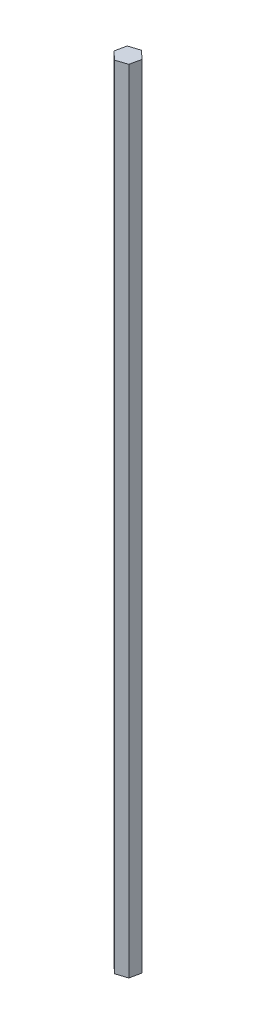
ISO-10303-21;
HEADER;
FILE_DESCRIPTION(('STEP AP214'),'2;1');
FILE_NAME('part.step','',(''),(''),'','','');
FILE_SCHEMA(('AUTOMOTIVE_DESIGN { 1 0 10303 214 1 1 1 1 }'));
ENDSEC;
DATA;
#1=APPLICATION_CONTEXT('core data for automotive mechanical design processes');
#2=APPLICATION_PROTOCOL_DEFINITION('international standard','automotive_design',2000,#1);
#3=PRODUCT_CONTEXT('',#1,'mechanical');
#4=PRODUCT('Part','Part','',(#3));
#5=PRODUCT_RELATED_PRODUCT_CATEGORY('part','',(#4));
#6=PRODUCT_DEFINITION_FORMATION('','',#4);
#7=PRODUCT_DEFINITION_CONTEXT('part definition',#1,'design');
#8=PRODUCT_DEFINITION('design','',#6,#7);
#9=PRODUCT_DEFINITION_SHAPE('','',#8);
#10=(LENGTH_UNIT() NAMED_UNIT(*) SI_UNIT(.MILLI.,.METRE.));
#11=(NAMED_UNIT(*) PLANE_ANGLE_UNIT() SI_UNIT($,.RADIAN.));
#12=(NAMED_UNIT(*) SI_UNIT($,.STERADIAN.) SOLID_ANGLE_UNIT());
#13=UNCERTAINTY_MEASURE_WITH_UNIT(LENGTH_MEASURE(1.E-05),#10,'distance_accuracy_value','');
#14=(GEOMETRIC_REPRESENTATION_CONTEXT(3) GLOBAL_UNCERTAINTY_ASSIGNED_CONTEXT((#13)) GLOBAL_UNIT_ASSIGNED_CONTEXT((#10,
#11,#12)) REPRESENTATION_CONTEXT('',''));
#15=CARTESIAN_POINT('',(0.,0.,0.));
#16=DIRECTION('',(0.,0.,1.));
#17=DIRECTION('',(1.,0.,0.));
#18=AXIS2_PLACEMENT_3D('',#15,#16,#17);
#19=CARTESIAN_POINT('',(-0.61182187926995,203.2,2.82117126764399));
#20=DIRECTION('',(-0.305094633460301,0.,-0.952322038300976));
#21=DIRECTION('',(-0.952322038300976,0.,0.305094633460301));
#22=AXIS2_PLACEMENT_3D('',#19,#20,#21);
#23=PLANE('',#22);
#24=DIRECTION('',(0.952322038300976,0.,-0.305094633460301));
#25=VECTOR('',#24,1.);
#26=CARTESIAN_POINT('',(-0.61182187926995,0.,2.82117126764399));
#27=LINE('',#26,#25);
#28=CARTESIAN_POINT('',(-0.61182187926995,0.,2.82117126764399));
#29=VERTEX_POINT('',#28);
#30=CARTESIAN_POINT('',(2.13729504657146,0.,1.94043892386091));
#31=VERTEX_POINT('',#30);
#32=EDGE_CURVE('E117',#29,#31,#27,.T.);
#33=ORIENTED_EDGE('',*,*,#32,.T.);
#34=DIRECTION('',(0.,-1.,0.));
#35=VECTOR('',#34,1.);
#36=CARTESIAN_POINT('',(2.13729504657146,203.2,1.94043892386091));
#37=LINE('',#36,#35);
#38=CARTESIAN_POINT('',(2.13729504657146,203.2,1.94043892386091));
#39=VERTEX_POINT('',#38);
#40=EDGE_CURVE('E11',#39,#31,#37,.T.);
#41=ORIENTED_EDGE('',*,*,#40,.F.);
#42=DIRECTION('',(0.952322038300976,0.,-0.305094633460301));
#43=VECTOR('',#42,1.);
#44=CARTESIAN_POINT('',(-0.61182187926995,203.2,2.82117126764399));
#45=LINE('',#44,#43);
#46=CARTESIAN_POINT('',(-0.61182187926995,203.2,2.82117126764399));
#47=VERTEX_POINT('',#46);
#48=EDGE_CURVE('E127',#47,#39,#45,.T.);
#49=ORIENTED_EDGE('',*,*,#48,.F.);
#50=DIRECTION('',(0.,-1.,0.));
#51=VECTOR('',#50,1.);
#52=CARTESIAN_POINT('',(-0.61182187926995,203.2,2.82117126764399));
#53=LINE('',#52,#51);
#54=EDGE_CURVE('E113',#47,#29,#53,.T.);
#55=ORIENTED_EDGE('',*,*,#54,.T.);
#56=EDGE_LOOP('',(#33,#41,#49,#55));
#57=FACE_BOUND('',#56,.T.);
#58=ADVANCED_FACE('F33',(#57),#23,.F.);
#59=CARTESIAN_POINT('',(2.13729504657146,203.2,1.94043892386091));
#60=DIRECTION('',(-0.977282394482572,0.,-0.211941316015566));
#61=DIRECTION('',(-0.211941316015566,0.,0.977282394482572));
#62=AXIS2_PLACEMENT_3D('',#59,#60,#61);
#63=PLANE('',#62);
#64=DIRECTION('',(0.211941316015566,0.,-0.977282394482572));
#65=VECTOR('',#64,1.);
#66=CARTESIAN_POINT('',(2.13729504657146,0.,1.94043892386091));
#67=LINE('',#66,#65);
#68=CARTESIAN_POINT('',(2.74911692584142,0.,-0.880732343783076));
#69=VERTEX_POINT('',#68);
#70=EDGE_CURVE('E120',#31,#69,#67,.T.);
#71=ORIENTED_EDGE('',*,*,#70,.T.);
#72=DIRECTION('',(0.,-1.,0.));
#73=VECTOR('',#72,1.);
#74=CARTESIAN_POINT('',(2.74911692584142,203.2,-0.880732343783076));
#75=LINE('',#74,#73);
#76=CARTESIAN_POINT('',(2.74911692584142,203.2,-0.880732343783076));
#77=VERTEX_POINT('',#76);
#78=EDGE_CURVE('E41',#77,#69,#75,.T.);
#79=ORIENTED_EDGE('',*,*,#78,.F.);
#80=DIRECTION('',(0.211941316015566,0.,-0.977282394482572));
#81=VECTOR('',#80,1.);
#82=CARTESIAN_POINT('',(2.13729504657146,203.2,1.94043892386091));
#83=LINE('',#82,#81);
#84=EDGE_CURVE('E86',#39,#77,#83,.T.);
#85=ORIENTED_EDGE('',*,*,#84,.F.);
#86=ORIENTED_EDGE('',*,*,#40,.T.);
#87=EDGE_LOOP('',(#71,#79,#85,#86));
#88=FACE_BOUND('',#87,.T.);
#89=ADVANCED_FACE('F151',(#88),#63,.F.);
#90=CARTESIAN_POINT('',(2.74911692584142,203.2,-0.880732343783076));
#91=DIRECTION('',(-0.672187761022271,0.,0.74038072228541));
#92=DIRECTION('',(0.74038072228541,0.,0.672187761022271));
#93=AXIS2_PLACEMENT_3D('',#90,#91,#92);
#94=PLANE('',#93);
#95=DIRECTION('',(-0.74038072228541,0.,-0.672187761022271));
#96=VECTOR('',#95,1.);
#97=CARTESIAN_POINT('',(2.74911692584142,0.,-0.880732343783076));
#98=LINE('',#97,#96);
#99=CARTESIAN_POINT('',(0.611821879269952,0.,-2.82117126764399));
#100=VERTEX_POINT('',#99);
#101=EDGE_CURVE('E122',#69,#100,#98,.T.);
#102=ORIENTED_EDGE('',*,*,#101,.T.);
#103=DIRECTION('',(0.,-1.,0.));
#104=VECTOR('',#103,1.);
#105=CARTESIAN_POINT('',(0.611821879269952,203.2,-2.82117126764399));
#106=LINE('',#105,#104);
#107=CARTESIAN_POINT('',(0.611821879269952,203.2,-2.82117126764399));
#108=VERTEX_POINT('',#107);
#109=EDGE_CURVE('E108',#108,#100,#106,.T.);
#110=ORIENTED_EDGE('',*,*,#109,.F.);
#111=DIRECTION('',(-0.74038072228541,0.,-0.672187761022271));
#112=VECTOR('',#111,1.);
#113=CARTESIAN_POINT('',(2.74911692584142,203.2,-0.880732343783076));
#114=LINE('',#113,#112);
#115=EDGE_CURVE('E99',#77,#108,#114,.T.);
#116=ORIENTED_EDGE('',*,*,#115,.F.);
#117=ORIENTED_EDGE('',*,*,#78,.T.);
#118=EDGE_LOOP('',(#102,#110,#116,#117));
#119=FACE_BOUND('',#118,.T.);
#120=ADVANCED_FACE('F133',(#119),#94,.F.);
#121=CARTESIAN_POINT('',(0.611821879269952,203.2,-2.82117126764399));
#122=DIRECTION('',(0.305094633460301,0.,0.952322038300976));
#123=DIRECTION('',(0.952322038300976,0.,-0.305094633460301));
#124=AXIS2_PLACEMENT_3D('',#121,#122,#123);
#125=PLANE('',#124);
#126=DIRECTION('',(-0.952322038300976,0.,0.305094633460301));
#127=VECTOR('',#126,1.);
#128=CARTESIAN_POINT('',(0.611821879269952,0.,-2.82117126764399));
#129=LINE('',#128,#127);
#130=CARTESIAN_POINT('',(-2.13729504657146,0.,-1.94043892386091));
#131=VERTEX_POINT('',#130);
#132=EDGE_CURVE('E107',#100,#131,#129,.T.);
#133=ORIENTED_EDGE('',*,*,#132,.T.);
#134=DIRECTION('',(0.,-1.,0.));
#135=VECTOR('',#134,1.);
#136=CARTESIAN_POINT('',(-2.13729504657146,203.2,-1.94043892386091));
#137=LINE('',#136,#135);
#138=CARTESIAN_POINT('',(-2.13729504657146,203.2,-1.94043892386091));
#139=VERTEX_POINT('',#138);
#140=EDGE_CURVE('E104',#139,#131,#137,.T.);
#141=ORIENTED_EDGE('',*,*,#140,.F.);
#142=DIRECTION('',(-0.952322038300976,0.,0.305094633460301));
#143=VECTOR('',#142,1.);
#144=CARTESIAN_POINT('',(0.611821879269952,203.2,-2.82117126764399));
#145=LINE('',#144,#143);
#146=EDGE_CURVE('E93',#108,#139,#145,.T.);
#147=ORIENTED_EDGE('',*,*,#146,.F.);
#148=ORIENTED_EDGE('',*,*,#109,.T.);
#149=EDGE_LOOP('',(#133,#141,#147,#148));
#150=FACE_BOUND('',#149,.T.);
#151=ADVANCED_FACE('F105',(#150),#125,.F.);
#152=CARTESIAN_POINT('',(-2.13729504657146,203.2,-1.94043892386091));
#153=DIRECTION('',(0.977282394482572,0.,0.211941316015565));
#154=DIRECTION('',(0.211941316015565,0.,-0.977282394482572));
#155=AXIS2_PLACEMENT_3D('',#152,#153,#154);
#156=PLANE('',#155);
#157=DIRECTION('',(-0.211941316015565,0.,0.977282394482572));
#158=VECTOR('',#157,1.);
#159=CARTESIAN_POINT('',(-2.13729504657146,0.,-1.94043892386091));
#160=LINE('',#159,#158);
#161=CARTESIAN_POINT('',(-2.74911692584141,0.,0.88073234378308));
#162=VERTEX_POINT('',#161);
#163=EDGE_CURVE('E72',#131,#162,#160,.T.);
#164=ORIENTED_EDGE('',*,*,#163,.T.);
#165=DIRECTION('',(0.,-1.,0.));
#166=VECTOR('',#165,1.);
#167=CARTESIAN_POINT('',(-2.74911692584141,203.2,0.88073234378308));
#168=LINE('',#167,#166);
#169=CARTESIAN_POINT('',(-2.74911692584141,203.2,0.88073234378308));
#170=VERTEX_POINT('',#169);
#171=EDGE_CURVE('E109',#170,#162,#168,.T.);
#172=ORIENTED_EDGE('',*,*,#171,.F.);
#173=DIRECTION('',(-0.211941316015565,0.,0.977282394482572));
#174=VECTOR('',#173,1.);
#175=CARTESIAN_POINT('',(-2.13729504657146,203.2,-1.94043892386091));
#176=LINE('',#175,#174);
#177=EDGE_CURVE('E97',#139,#170,#176,.T.);
#178=ORIENTED_EDGE('',*,*,#177,.F.);
#179=ORIENTED_EDGE('',*,*,#140,.T.);
#180=EDGE_LOOP('',(#164,#172,#178,#179));
#181=FACE_BOUND('',#180,.T.);
#182=ADVANCED_FACE('F111',(#181),#156,.F.);
#183=CARTESIAN_POINT('',(-2.74911692584141,203.2,0.88073234378308));
#184=DIRECTION('',(0.672187761022271,0.,-0.74038072228541));
#185=DIRECTION('',(-0.74038072228541,0.,-0.672187761022271));
#186=AXIS2_PLACEMENT_3D('',#183,#184,#185);
#187=PLANE('',#186);
#188=DIRECTION('',(0.740380722285411,0.,0.672187761022271));
#189=VECTOR('',#188,1.);
#190=CARTESIAN_POINT('',(-2.74911692584141,0.,0.88073234378308));
#191=LINE('',#190,#189);
#192=EDGE_CURVE('E78',#162,#29,#191,.T.);
#193=ORIENTED_EDGE('',*,*,#192,.T.);
#194=ORIENTED_EDGE('',*,*,#54,.F.);
#195=DIRECTION('',(0.740380722285411,0.,0.672187761022271));
#196=VECTOR('',#195,1.);
#197=CARTESIAN_POINT('',(-2.74911692584141,203.2,0.88073234378308));
#198=LINE('',#197,#196);
#199=EDGE_CURVE('E49',#170,#47,#198,.T.);
#200=ORIENTED_EDGE('',*,*,#199,.F.);
#201=ORIENTED_EDGE('',*,*,#171,.T.);
#202=EDGE_LOOP('',(#193,#194,#200,#201));
#203=FACE_BOUND('',#202,.T.);
#204=ADVANCED_FACE('F140',(#203),#187,.F.);
#205=CARTESIAN_POINT('',(0.,203.2,0.));
#206=DIRECTION('',(0.,1.,0.));
#207=DIRECTION('',(0.,0.,1.));
#208=AXIS2_PLACEMENT_3D('',#205,#206,#207);
#209=PLANE('',#208);
#210=ORIENTED_EDGE('',*,*,#48,.T.);
#211=ORIENTED_EDGE('',*,*,#84,.T.);
#212=ORIENTED_EDGE('',*,*,#115,.T.);
#213=ORIENTED_EDGE('',*,*,#146,.T.);
#214=ORIENTED_EDGE('',*,*,#177,.T.);
#215=ORIENTED_EDGE('',*,*,#199,.T.);
#216=EDGE_LOOP('',(#210,#211,#212,#213,#214,#215));
#217=FACE_BOUND('',#216,.T.);
#218=ADVANCED_FACE('F95',(#217),#209,.T.);
#219=CARTESIAN_POINT('',(0.,0.,0.));
#220=DIRECTION('',(0.,1.,0.));
#221=DIRECTION('',(0.,0.,1.));
#222=AXIS2_PLACEMENT_3D('',#219,#220,#221);
#223=PLANE('',#222);
#224=ORIENTED_EDGE('',*,*,#32,.F.);
#225=ORIENTED_EDGE('',*,*,#192,.F.);
#226=ORIENTED_EDGE('',*,*,#163,.F.);
#227=ORIENTED_EDGE('',*,*,#132,.F.);
#228=ORIENTED_EDGE('',*,*,#101,.F.);
#229=ORIENTED_EDGE('',*,*,#70,.F.);
#230=EDGE_LOOP('',(#224,#225,#226,#227,#228,#229));
#231=FACE_BOUND('',#230,.T.);
#232=ADVANCED_FACE('F136',(#231),#223,.F.);
#233=CLOSED_SHELL('',(#58,#89,#120,#151,#182,#204,#218,#232));
#234=MANIFOLD_SOLID_BREP('B2',#233);
#235=ADVANCED_BREP_SHAPE_REPRESENTATION('',(#18,#234),#14);
#236=SHAPE_DEFINITION_REPRESENTATION(#9,#235);
ENDSEC;
END-ISO-10303-21;
